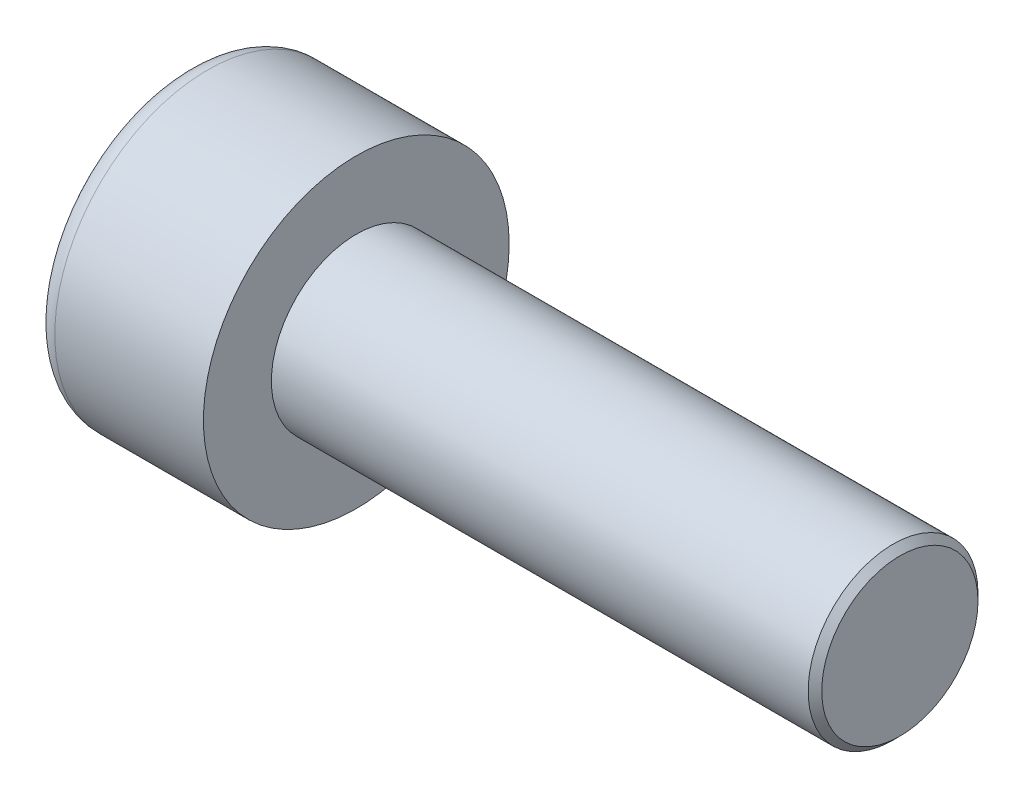
ISO-10303-21;
HEADER;
FILE_DESCRIPTION(('STEP AP214'),'2;1');
FILE_NAME('part.step','',(''),(''),'','','');
FILE_SCHEMA(('AUTOMOTIVE_DESIGN { 1 0 10303 214 1 1 1 1 }'));
ENDSEC;
DATA;
#1=APPLICATION_CONTEXT('core data for automotive mechanical design processes');
#2=APPLICATION_PROTOCOL_DEFINITION('international standard','automotive_design',2000,#1);
#3=PRODUCT_CONTEXT('',#1,'mechanical');
#4=PRODUCT('Part','Part','',(#3));
#5=PRODUCT_RELATED_PRODUCT_CATEGORY('part','',(#4));
#6=PRODUCT_DEFINITION_FORMATION('','',#4);
#7=PRODUCT_DEFINITION_CONTEXT('part definition',#1,'design');
#8=PRODUCT_DEFINITION('design','',#6,#7);
#9=PRODUCT_DEFINITION_SHAPE('','',#8);
#10=(LENGTH_UNIT() NAMED_UNIT(*) SI_UNIT(.MILLI.,.METRE.));
#11=(NAMED_UNIT(*) PLANE_ANGLE_UNIT() SI_UNIT($,.RADIAN.));
#12=(NAMED_UNIT(*) SI_UNIT($,.STERADIAN.) SOLID_ANGLE_UNIT());
#13=UNCERTAINTY_MEASURE_WITH_UNIT(LENGTH_MEASURE(1.E-05),#10,'distance_accuracy_value','');
#14=(GEOMETRIC_REPRESENTATION_CONTEXT(3) GLOBAL_UNCERTAINTY_ASSIGNED_CONTEXT((#13)) GLOBAL_UNIT_ASSIGNED_CONTEXT((#10,
#11,#12)) REPRESENTATION_CONTEXT('',''));
#15=CARTESIAN_POINT('',(0.,0.,0.));
#16=DIRECTION('',(0.,0.,1.));
#17=DIRECTION('',(1.,0.,0.));
#18=AXIS2_PLACEMENT_3D('',#15,#16,#17);
#19=CARTESIAN_POINT('',(1.1,-1.,-0.577350269189627));
#20=DIRECTION('',(-1.,0.,0.));
#21=DIRECTION('',(0.,0.,1.));
#22=AXIS2_PLACEMENT_3D('',#19,#20,#21);
#23=PLANE('',#22);
#24=DIRECTION('',(0.,-0.866025403784439,-0.5));
#25=VECTOR('',#24,1.);
#26=CARTESIAN_POINT('',(1.1,0.,1.15470053837925));
#27=LINE('',#26,#25);
#28=CARTESIAN_POINT('',(1.1,-0.5,0.866025403784438));
#29=VERTEX_POINT('',#28);
#30=CARTESIAN_POINT('',(1.1,-1.,0.577350269189626));
#31=VERTEX_POINT('',#30);
#32=EDGE_CURVE('E151',#29,#31,#27,.T.);
#33=ORIENTED_EDGE('',*,*,#32,.F.);
#34=CARTESIAN_POINT('',(1.1,0.,0.));
#35=DIRECTION('',(-1.,0.,0.));
#36=DIRECTION('',(0.,0.,1.));
#37=AXIS2_PLACEMENT_3D('',#34,#35,#36);
#38=CIRCLE('',#37,1.);
#39=CARTESIAN_POINT('',(1.1,-1.,0.));
#40=VERTEX_POINT('',#39);
#41=EDGE_CURVE('E46',#29,#40,#38,.F.);
#42=ORIENTED_EDGE('',*,*,#41,.T.);
#43=DIRECTION('',(0.,0.,-1.));
#44=VECTOR('',#43,1.);
#45=CARTESIAN_POINT('',(1.1,-1.,0.577350269189626));
#46=LINE('',#45,#44);
#47=EDGE_CURVE('E156',#31,#40,#46,.T.);
#48=ORIENTED_EDGE('',*,*,#47,.F.);
#49=EDGE_LOOP('',(#33,#42,#48));
#50=FACE_BOUND('',#49,.T.);
#51=ADVANCED_FACE('F31',(#50),#23,.T.);
#52=CARTESIAN_POINT('',(1.1,-1.,-0.577350269189627));
#53=VERTEX_POINT('',#52);
#54=EDGE_CURVE('E155',#40,#53,#46,.T.);
#55=ORIENTED_EDGE('',*,*,#54,.F.);
#56=CARTESIAN_POINT('',(1.1,-0.5,-0.866025403784439));
#57=VERTEX_POINT('',#56);
#58=EDGE_CURVE('E131',#40,#57,#38,.F.);
#59=ORIENTED_EDGE('',*,*,#58,.T.);
#60=DIRECTION('',(0.,0.866025403784439,-0.5));
#61=VECTOR('',#60,1.);
#62=CARTESIAN_POINT('',(1.1,-1.,-0.577350269189627));
#63=LINE('',#62,#61);
#64=EDGE_CURVE('E139',#53,#57,#63,.T.);
#65=ORIENTED_EDGE('',*,*,#64,.F.);
#66=EDGE_LOOP('',(#55,#59,#65));
#67=FACE_BOUND('',#66,.T.);
#68=ADVANCED_FACE('F211',(#67),#23,.T.);
#69=CARTESIAN_POINT('',(1.1,0.,-1.15470053837925));
#70=VERTEX_POINT('',#69);
#71=EDGE_CURVE('E129',#57,#70,#63,.T.);
#72=ORIENTED_EDGE('',*,*,#71,.F.);
#73=CARTESIAN_POINT('',(1.1,0.5,-0.866025403784438));
#74=VERTEX_POINT('',#73);
#75=EDGE_CURVE('E113',#57,#74,#38,.F.);
#76=ORIENTED_EDGE('',*,*,#75,.T.);
#77=DIRECTION('',(0.,0.866025403784439,0.5));
#78=VECTOR('',#77,1.);
#79=CARTESIAN_POINT('',(1.1,0.,-1.15470053837925));
#80=LINE('',#79,#78);
#81=EDGE_CURVE('E127',#70,#74,#80,.T.);
#82=ORIENTED_EDGE('',*,*,#81,.F.);
#83=EDGE_LOOP('',(#72,#76,#82));
#84=FACE_BOUND('',#83,.T.);
#85=ADVANCED_FACE('F125',(#84),#23,.T.);
#86=CARTESIAN_POINT('',(1.1,1.,-0.577350269189625));
#87=VERTEX_POINT('',#86);
#88=EDGE_CURVE('E133',#74,#87,#80,.T.);
#89=ORIENTED_EDGE('',*,*,#88,.F.);
#90=CARTESIAN_POINT('',(1.1,0.,0.));
#91=DIRECTION('',(1.,0.,0.));
#92=DIRECTION('',(0.,0.,-1.));
#93=AXIS2_PLACEMENT_3D('',#90,#91,#92);
#94=CIRCLE('',#93,1.);
#95=CARTESIAN_POINT('',(1.1,1.,0.));
#96=VERTEX_POINT('',#95);
#97=EDGE_CURVE('E111',#74,#96,#94,.T.);
#98=ORIENTED_EDGE('',*,*,#97,.T.);
#99=DIRECTION('',(0.,0.,1.));
#100=VECTOR('',#99,1.);
#101=CARTESIAN_POINT('',(1.1,1.,-0.577350269189625));
#102=LINE('',#101,#100);
#103=EDGE_CURVE('E136',#87,#96,#102,.T.);
#104=ORIENTED_EDGE('',*,*,#103,.F.);
#105=EDGE_LOOP('',(#89,#98,#104));
#106=FACE_BOUND('',#105,.T.);
#107=ADVANCED_FACE('F134',(#106),#23,.T.);
#108=CARTESIAN_POINT('',(1.1,1.,0.577350269189626));
#109=VERTEX_POINT('',#108);
#110=EDGE_CURVE('E143',#96,#109,#102,.T.);
#111=ORIENTED_EDGE('',*,*,#110,.F.);
#112=CARTESIAN_POINT('',(1.1,0.5,0.866025403784438));
#113=VERTEX_POINT('',#112);
#114=EDGE_CURVE('E116',#96,#113,#38,.F.);
#115=ORIENTED_EDGE('',*,*,#114,.T.);
#116=DIRECTION('',(0.,-0.866025403784439,0.5));
#117=VECTOR('',#116,1.);
#118=CARTESIAN_POINT('',(1.1,1.,0.577350269189626));
#119=LINE('',#118,#117);
#120=EDGE_CURVE('E148',#109,#113,#119,.T.);
#121=ORIENTED_EDGE('',*,*,#120,.F.);
#122=EDGE_LOOP('',(#111,#115,#121));
#123=FACE_BOUND('',#122,.T.);
#124=ADVANCED_FACE('F223',(#123),#23,.T.);
#125=CARTESIAN_POINT('',(1.1,0.,1.15470053837925));
#126=VERTEX_POINT('',#125);
#127=EDGE_CURVE('E147',#113,#126,#119,.T.);
#128=ORIENTED_EDGE('',*,*,#127,.F.);
#129=EDGE_CURVE('E191',#113,#29,#38,.F.);
#130=ORIENTED_EDGE('',*,*,#129,.T.);
#131=EDGE_CURVE('E152',#126,#29,#27,.T.);
#132=ORIENTED_EDGE('',*,*,#131,.F.);
#133=EDGE_LOOP('',(#128,#130,#132));
#134=FACE_BOUND('',#133,.T.);
#135=ADVANCED_FACE('F214',(#134),#23,.T.);
#136=CARTESIAN_POINT('',(0.,0.,0.));
#137=DIRECTION('',(1.,0.,0.));
#138=DIRECTION('',(0.,0.,-1.));
#139=AXIS2_PLACEMENT_3D('',#136,#137,#138);
#140=PLANE('',#139);
#141=CARTESIAN_POINT('',(0.,0.,0.));
#142=DIRECTION('',(1.,0.,0.));
#143=DIRECTION('',(0.,0.,-1.));
#144=AXIS2_PLACEMENT_3D('',#141,#142,#143);
#145=CIRCLE('',#144,1.9375);
#146=CARTESIAN_POINT('',(0.,0.,-1.9375));
#147=VERTEX_POINT('',#146);
#148=EDGE_CURVE('E196',#147,#147,#145,.F.);
#149=ORIENTED_EDGE('',*,*,#148,.T.);
#150=EDGE_LOOP('',(#149));
#151=FACE_BOUND('',#150,.T.);
#152=DIRECTION('',(0.,0.866025403784439,-0.5));
#153=VECTOR('',#152,1.);
#154=CARTESIAN_POINT('',(0.,-1.,-0.577350269189627));
#155=LINE('',#154,#153);
#156=CARTESIAN_POINT('',(0.,-1.,-0.577350269189627));
#157=VERTEX_POINT('',#156);
#158=CARTESIAN_POINT('',(0.,0.,-1.15470053837925));
#159=VERTEX_POINT('',#158);
#160=EDGE_CURVE('E54',#157,#159,#155,.T.);
#161=ORIENTED_EDGE('',*,*,#160,.T.);
#162=DIRECTION('',(0.,0.866025403784439,0.5));
#163=VECTOR('',#162,1.);
#164=CARTESIAN_POINT('',(0.,0.,-1.15470053837925));
#165=LINE('',#164,#163);
#166=CARTESIAN_POINT('',(0.,1.,-0.577350269189625));
#167=VERTEX_POINT('',#166);
#168=EDGE_CURVE('E161',#159,#167,#165,.T.);
#169=ORIENTED_EDGE('',*,*,#168,.T.);
#170=DIRECTION('',(0.,0.,1.));
#171=VECTOR('',#170,1.);
#172=CARTESIAN_POINT('',(0.,1.,-0.577350269189625));
#173=LINE('',#172,#171);
#174=CARTESIAN_POINT('',(0.,1.,0.577350269189626));
#175=VERTEX_POINT('',#174);
#176=EDGE_CURVE('E164',#167,#175,#173,.T.);
#177=ORIENTED_EDGE('',*,*,#176,.T.);
#178=DIRECTION('',(0.,-0.866025403784439,0.5));
#179=VECTOR('',#178,1.);
#180=CARTESIAN_POINT('',(0.,1.,0.577350269189626));
#181=LINE('',#180,#179);
#182=CARTESIAN_POINT('',(0.,0.,1.15470053837925));
#183=VERTEX_POINT('',#182);
#184=EDGE_CURVE('E167',#175,#183,#181,.T.);
#185=ORIENTED_EDGE('',*,*,#184,.T.);
#186=DIRECTION('',(0.,-0.866025403784439,-0.5));
#187=VECTOR('',#186,1.);
#188=CARTESIAN_POINT('',(0.,0.,1.15470053837925));
#189=LINE('',#188,#187);
#190=CARTESIAN_POINT('',(0.,-1.,0.577350269189626));
#191=VERTEX_POINT('',#190);
#192=EDGE_CURVE('E170',#183,#191,#189,.T.);
#193=ORIENTED_EDGE('',*,*,#192,.T.);
#194=DIRECTION('',(0.,0.,-1.));
#195=VECTOR('',#194,1.);
#196=CARTESIAN_POINT('',(0.,-1.,0.577350269189626));
#197=LINE('',#196,#195);
#198=EDGE_CURVE('E173',#191,#157,#197,.T.);
#199=ORIENTED_EDGE('',*,*,#198,.T.);
#200=EDGE_LOOP('',(#161,#169,#177,#185,#193,#199));
#201=FACE_BOUND('',#200,.T.);
#202=ADVANCED_FACE('F222',(#151,#201),#140,.F.);
#203=CARTESIAN_POINT('',(2.5,0.,0.));
#204=DIRECTION('',(1.,0.,0.));
#205=DIRECTION('',(0.,0.,-1.));
#206=AXIS2_PLACEMENT_3D('',#203,#204,#205);
#207=PLANE('',#206);
#208=CARTESIAN_POINT('',(2.5,0.,0.));
#209=DIRECTION('',(1.,0.,0.));
#210=DIRECTION('',(0.,0.,-1.));
#211=AXIS2_PLACEMENT_3D('',#208,#209,#210);
#212=CIRCLE('',#211,2.25);
#213=CARTESIAN_POINT('',(2.5,0.,-2.25));
#214=VERTEX_POINT('',#213);
#215=EDGE_CURVE('E189',#214,#214,#212,.T.);
#216=ORIENTED_EDGE('',*,*,#215,.T.);
#217=EDGE_LOOP('',(#216));
#218=FACE_BOUND('',#217,.T.);
#219=CARTESIAN_POINT('',(2.5,0.,0.));
#220=DIRECTION('',(1.,0.,0.));
#221=DIRECTION('',(0.,0.,-1.));
#222=AXIS2_PLACEMENT_3D('',#219,#220,#221);
#223=CIRCLE('',#222,1.25);
#224=CARTESIAN_POINT('',(2.5,0.,-1.25));
#225=VERTEX_POINT('',#224);
#226=EDGE_CURVE('E186',#225,#225,#223,.T.);
#227=ORIENTED_EDGE('',*,*,#226,.F.);
#228=EDGE_LOOP('',(#227));
#229=FACE_BOUND('',#228,.T.);
#230=ADVANCED_FACE('F229',(#218,#229),#207,.T.);
#231=CARTESIAN_POINT('',(2.5,0.,0.));
#232=DIRECTION('',(-1.,0.,0.));
#233=DIRECTION('',(0.,0.,1.));
#234=AXIS2_PLACEMENT_3D('',#231,#232,#233);
#235=CYLINDRICAL_SURFACE('',#234,2.25);
#236=CARTESIAN_POINT('',(0.3125,0.,0.));
#237=DIRECTION('',(1.,0.,0.));
#238=DIRECTION('',(0.,0.,-1.));
#239=AXIS2_PLACEMENT_3D('',#236,#237,#238);
#240=CIRCLE('',#239,2.25);
#241=CARTESIAN_POINT('',(0.3125,0.,-2.25));
#242=VERTEX_POINT('',#241);
#243=EDGE_CURVE('E193',#242,#242,#240,.T.);
#244=ORIENTED_EDGE('',*,*,#243,.T.);
#245=EDGE_LOOP('',(#244));
#246=FACE_BOUND('',#245,.T.);
#247=ORIENTED_EDGE('',*,*,#215,.F.);
#248=EDGE_LOOP('',(#247));
#249=FACE_BOUND('',#248,.T.);
#250=ADVANCED_FACE('F274',(#246,#249),#235,.T.);
#251=CARTESIAN_POINT('',(10.5,0.,0.));
#252=DIRECTION('',(-1.,0.,0.));
#253=DIRECTION('',(0.,0.,1.));
#254=AXIS2_PLACEMENT_3D('',#251,#252,#253);
#255=CYLINDRICAL_SURFACE('',#254,1.25);
#256=CARTESIAN_POINT('',(10.4,0.,0.));
#257=DIRECTION('',(1.,0.,0.));
#258=DIRECTION('',(0.,0.,-1.));
#259=AXIS2_PLACEMENT_3D('',#256,#257,#258);
#260=CIRCLE('',#259,1.25);
#261=CARTESIAN_POINT('',(10.4,0.,-1.25));
#262=VERTEX_POINT('',#261);
#263=EDGE_CURVE('E11',#262,#262,#260,.F.);
#264=ORIENTED_EDGE('',*,*,#263,.T.);
#265=EDGE_LOOP('',(#264));
#266=FACE_BOUND('',#265,.T.);
#267=ORIENTED_EDGE('',*,*,#226,.T.);
#268=EDGE_LOOP('',(#267));
#269=FACE_BOUND('',#268,.T.);
#270=ADVANCED_FACE('F271',(#266,#269),#255,.T.);
#271=CARTESIAN_POINT('',(10.5,0.,0.));
#272=DIRECTION('',(1.,0.,0.));
#273=DIRECTION('',(0.,0.,-1.));
#274=AXIS2_PLACEMENT_3D('',#271,#272,#273);
#275=PLANE('',#274);
#276=CARTESIAN_POINT('',(10.5,0.,0.));
#277=DIRECTION('',(1.,0.,0.));
#278=DIRECTION('',(0.,0.,-1.));
#279=AXIS2_PLACEMENT_3D('',#276,#277,#278);
#280=CIRCLE('',#279,1.15);
#281=CARTESIAN_POINT('',(10.5,0.,-1.15));
#282=VERTEX_POINT('',#281);
#283=EDGE_CURVE('E39',#282,#282,#280,.T.);
#284=ORIENTED_EDGE('',*,*,#283,.T.);
#285=EDGE_LOOP('',(#284));
#286=FACE_BOUND('',#285,.T.);
#287=ADVANCED_FACE('F201',(#286),#275,.T.);
#288=CARTESIAN_POINT('',(1.1,-1.,-0.577350269189627));
#289=DIRECTION('',(0.,0.5,0.866025403784439));
#290=DIRECTION('',(0.,-0.866025403784439,0.5));
#291=AXIS2_PLACEMENT_3D('',#288,#289,#290);
#292=PLANE('',#291);
#293=ORIENTED_EDGE('',*,*,#160,.F.);
#294=DIRECTION('',(-1.,0.,0.));
#295=VECTOR('',#294,1.);
#296=CARTESIAN_POINT('',(1.1,-1.,-0.577350269189627));
#297=LINE('',#296,#295);
#298=EDGE_CURVE('E159',#53,#157,#297,.T.);
#299=ORIENTED_EDGE('',*,*,#298,.F.);
#300=ORIENTED_EDGE('',*,*,#64,.T.);
#301=ORIENTED_EDGE('',*,*,#71,.T.);
#302=DIRECTION('',(-1.,0.,0.));
#303=VECTOR('',#302,1.);
#304=CARTESIAN_POINT('',(1.1,0.,-1.15470053837925));
#305=LINE('',#304,#303);
#306=EDGE_CURVE('E142',#70,#159,#305,.T.);
#307=ORIENTED_EDGE('',*,*,#306,.T.);
#308=EDGE_LOOP('',(#293,#299,#300,#301,#307));
#309=FACE_BOUND('',#308,.T.);
#310=ADVANCED_FACE('F245',(#309),#292,.T.);
#311=CARTESIAN_POINT('',(1.1,0.,-1.15470053837925));
#312=DIRECTION('',(0.,-0.5,0.866025403784438));
#313=DIRECTION('',(0.,-0.866025403784438,-0.5));
#314=AXIS2_PLACEMENT_3D('',#311,#312,#313);
#315=PLANE('',#314);
#316=ORIENTED_EDGE('',*,*,#168,.F.);
#317=ORIENTED_EDGE('',*,*,#306,.F.);
#318=ORIENTED_EDGE('',*,*,#81,.T.);
#319=ORIENTED_EDGE('',*,*,#88,.T.);
#320=DIRECTION('',(-1.,0.,0.));
#321=VECTOR('',#320,1.);
#322=CARTESIAN_POINT('',(1.1,1.,-0.577350269189625));
#323=LINE('',#322,#321);
#324=EDGE_CURVE('E183',#87,#167,#323,.T.);
#325=ORIENTED_EDGE('',*,*,#324,.T.);
#326=EDGE_LOOP('',(#316,#317,#318,#319,#325));
#327=FACE_BOUND('',#326,.T.);
#328=ADVANCED_FACE('F141',(#327),#315,.T.);
#329=CARTESIAN_POINT('',(1.1,1.,-0.577350269189625));
#330=DIRECTION('',(0.,-1.,0.));
#331=DIRECTION('',(0.,0.,-1.));
#332=AXIS2_PLACEMENT_3D('',#329,#330,#331);
#333=PLANE('',#332);
#334=ORIENTED_EDGE('',*,*,#176,.F.);
#335=ORIENTED_EDGE('',*,*,#324,.F.);
#336=ORIENTED_EDGE('',*,*,#103,.T.);
#337=ORIENTED_EDGE('',*,*,#110,.T.);
#338=DIRECTION('',(-1.,0.,0.));
#339=VECTOR('',#338,1.);
#340=CARTESIAN_POINT('',(1.1,1.,0.577350269189626));
#341=LINE('',#340,#339);
#342=EDGE_CURVE('E181',#109,#175,#341,.T.);
#343=ORIENTED_EDGE('',*,*,#342,.T.);
#344=EDGE_LOOP('',(#334,#335,#336,#337,#343));
#345=FACE_BOUND('',#344,.T.);
#346=ADVANCED_FACE('F243',(#345),#333,.T.);
#347=CARTESIAN_POINT('',(1.1,1.,0.577350269189626));
#348=DIRECTION('',(0.,-0.5,-0.866025403784439));
#349=DIRECTION('',(0.,0.866025403784439,-0.5));
#350=AXIS2_PLACEMENT_3D('',#347,#348,#349);
#351=PLANE('',#350);
#352=ORIENTED_EDGE('',*,*,#184,.F.);
#353=ORIENTED_EDGE('',*,*,#342,.F.);
#354=ORIENTED_EDGE('',*,*,#120,.T.);
#355=ORIENTED_EDGE('',*,*,#127,.T.);
#356=DIRECTION('',(-1.,0.,0.));
#357=VECTOR('',#356,1.);
#358=CARTESIAN_POINT('',(1.1,0.,1.15470053837925));
#359=LINE('',#358,#357);
#360=EDGE_CURVE('E179',#126,#183,#359,.T.);
#361=ORIENTED_EDGE('',*,*,#360,.T.);
#362=EDGE_LOOP('',(#352,#353,#354,#355,#361));
#363=FACE_BOUND('',#362,.T.);
#364=ADVANCED_FACE('F240',(#363),#351,.T.);
#365=CARTESIAN_POINT('',(1.1,0.,1.15470053837925));
#366=DIRECTION('',(0.,0.5,-0.866025403784439));
#367=DIRECTION('',(0.,0.866025403784439,0.5));
#368=AXIS2_PLACEMENT_3D('',#365,#366,#367);
#369=PLANE('',#368);
#370=ORIENTED_EDGE('',*,*,#192,.F.);
#371=ORIENTED_EDGE('',*,*,#360,.F.);
#372=ORIENTED_EDGE('',*,*,#131,.T.);
#373=ORIENTED_EDGE('',*,*,#32,.T.);
#374=DIRECTION('',(-1.,0.,0.));
#375=VECTOR('',#374,1.);
#376=CARTESIAN_POINT('',(1.1,-1.,0.577350269189626));
#377=LINE('',#376,#375);
#378=EDGE_CURVE('E177',#31,#191,#377,.T.);
#379=ORIENTED_EDGE('',*,*,#378,.T.);
#380=EDGE_LOOP('',(#370,#371,#372,#373,#379));
#381=FACE_BOUND('',#380,.T.);
#382=ADVANCED_FACE('F254',(#381),#369,.T.);
#383=CARTESIAN_POINT('',(1.1,-1.,0.577350269189626));
#384=DIRECTION('',(0.,1.,0.));
#385=DIRECTION('',(0.,0.,1.));
#386=AXIS2_PLACEMENT_3D('',#383,#384,#385);
#387=PLANE('',#386);
#388=ORIENTED_EDGE('',*,*,#198,.F.);
#389=ORIENTED_EDGE('',*,*,#378,.F.);
#390=ORIENTED_EDGE('',*,*,#47,.T.);
#391=ORIENTED_EDGE('',*,*,#54,.T.);
#392=ORIENTED_EDGE('',*,*,#298,.T.);
#393=EDGE_LOOP('',(#388,#389,#390,#391,#392));
#394=FACE_BOUND('',#393,.T.);
#395=ADVANCED_FACE('F108',(#394),#387,.T.);
#396=CARTESIAN_POINT('',(1.1,0.,0.));
#397=DIRECTION('',(-1.,0.,0.));
#398=DIRECTION('',(0.,0.,1.));
#399=AXIS2_PLACEMENT_3D('',#396,#397,#398);
#400=CONICAL_SURFACE('',#399,1.,1.04719755119659);
#401=CARTESIAN_POINT('',(1.67735026918963,0.,0.));
#402=VERTEX_POINT('',#401);
#403=VERTEX_LOOP('',#402);
#404=FACE_BOUND('',#403,.T.);
#405=ORIENTED_EDGE('',*,*,#97,.F.);
#406=ORIENTED_EDGE('',*,*,#75,.F.);
#407=ORIENTED_EDGE('',*,*,#58,.F.);
#408=ORIENTED_EDGE('',*,*,#41,.F.);
#409=ORIENTED_EDGE('',*,*,#129,.F.);
#410=ORIENTED_EDGE('',*,*,#114,.F.);
#411=EDGE_LOOP('',(#405,#406,#407,#408,#409,#410));
#412=FACE_BOUND('',#411,.T.);
#413=ADVANCED_FACE('F105',(#404,#412),#400,.F.);
#414=CARTESIAN_POINT('',(0.3125,0.,0.));
#415=DIRECTION('',(1.,0.,0.));
#416=DIRECTION('',(0.,0.,-1.));
#417=AXIS2_PLACEMENT_3D('',#414,#415,#416);
#418=TOROIDAL_SURFACE('',#417,1.9375,0.3125);
#419=ORIENTED_EDGE('',*,*,#148,.F.);
#420=EDGE_LOOP('',(#419));
#421=FACE_BOUND('',#420,.T.);
#422=ORIENTED_EDGE('',*,*,#243,.F.);
#423=EDGE_LOOP('',(#422));
#424=FACE_BOUND('',#423,.T.);
#425=ADVANCED_FACE('F107',(#421,#424),#418,.T.);
#426=CARTESIAN_POINT('',(10.5,0.,0.));
#427=DIRECTION('',(-1.,0.,0.));
#428=DIRECTION('',(0.,0.,1.));
#429=AXIS2_PLACEMENT_3D('',#426,#427,#428);
#430=CONICAL_SURFACE('',#429,1.15,0.785398163397451);
#431=ORIENTED_EDGE('',*,*,#263,.F.);
#432=EDGE_LOOP('',(#431));
#433=FACE_BOUND('',#432,.T.);
#434=ORIENTED_EDGE('',*,*,#283,.F.);
#435=EDGE_LOOP('',(#434));
#436=FACE_BOUND('',#435,.T.);
#437=ADVANCED_FACE('F33',(#433,#436),#430,.T.);
#438=CLOSED_SHELL('',(#51,#68,#85,#107,#124,#135,#202,#230,#250,#270,#287,#310,#328,#346,#364,
#382,#395,#413,#425,#437));
#439=MANIFOLD_SOLID_BREP('B2',#438);
#440=ADVANCED_BREP_SHAPE_REPRESENTATION('',(#18,#439),#14);
#441=SHAPE_DEFINITION_REPRESENTATION(#9,#440);
ENDSEC;
END-ISO-10303-21;
